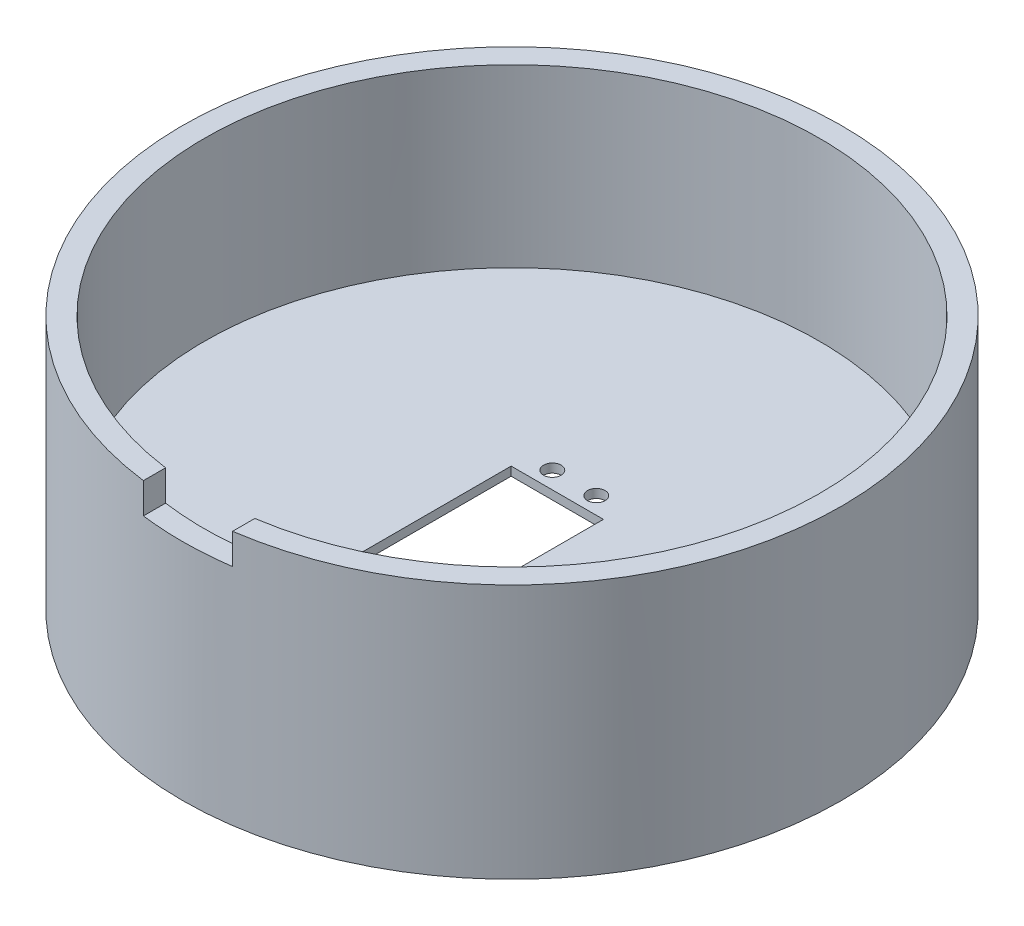
ISO-10303-21;
HEADER;
FILE_DESCRIPTION(('STEP AP214'),'2;1');
FILE_NAME('part.step','',(''),(''),'','','');
FILE_SCHEMA(('AUTOMOTIVE_DESIGN { 1 0 10303 214 1 1 1 1 }'));
ENDSEC;
DATA;
#1=APPLICATION_CONTEXT('core data for automotive mechanical design processes');
#2=APPLICATION_PROTOCOL_DEFINITION('international standard','automotive_design',2000,#1);
#3=PRODUCT_CONTEXT('',#1,'mechanical');
#4=PRODUCT('Part','Part','',(#3));
#5=PRODUCT_RELATED_PRODUCT_CATEGORY('part','',(#4));
#6=PRODUCT_DEFINITION_FORMATION('','',#4);
#7=PRODUCT_DEFINITION_CONTEXT('part definition',#1,'design');
#8=PRODUCT_DEFINITION('design','',#6,#7);
#9=PRODUCT_DEFINITION_SHAPE('','',#8);
#10=(LENGTH_UNIT() NAMED_UNIT(*) SI_UNIT(.MILLI.,.METRE.));
#11=(NAMED_UNIT(*) PLANE_ANGLE_UNIT() SI_UNIT($,.RADIAN.));
#12=(NAMED_UNIT(*) SI_UNIT($,.STERADIAN.) SOLID_ANGLE_UNIT());
#13=UNCERTAINTY_MEASURE_WITH_UNIT(LENGTH_MEASURE(1.E-05),#10,'distance_accuracy_value','');
#14=(GEOMETRIC_REPRESENTATION_CONTEXT(3) GLOBAL_UNCERTAINTY_ASSIGNED_CONTEXT((#13)) GLOBAL_UNIT_ASSIGNED_CONTEXT((#10,
#11,#12)) REPRESENTATION_CONTEXT('',''));
#15=CARTESIAN_POINT('',(0.,0.,0.));
#16=DIRECTION('',(0.,0.,1.));
#17=DIRECTION('',(1.,0.,0.));
#18=AXIS2_PLACEMENT_3D('',#15,#16,#17);
#19=CARTESIAN_POINT('',(0.,-2.,0.));
#20=DIRECTION('',(0.,1.,0.));
#21=DIRECTION('',(0.,0.,1.));
#22=AXIS2_PLACEMENT_3D('',#19,#20,#21);
#23=PLANE('',#22);
#24=CARTESIAN_POINT('',(5.,-2.,34.4507273600907));
#25=DIRECTION('',(0.,1.,0.));
#26=DIRECTION('',(0.,0.,1.));
#27=AXIS2_PLACEMENT_3D('',#24,#25,#26);
#28=CIRCLE('',#27,2.);
#29=CARTESIAN_POINT('',(5.,-2.,36.4507273600907));
#30=VERTEX_POINT('',#29);
#31=EDGE_CURVE('E162',#30,#30,#28,.F.);
#32=ORIENTED_EDGE('',*,*,#31,.F.);
#33=EDGE_LOOP('',(#32));
#34=FACE_BOUND('',#33,.T.);
#35=CARTESIAN_POINT('',(-4.99999999999999,-2.,34.4507273600907));
#36=DIRECTION('',(0.,1.,0.));
#37=DIRECTION('',(0.,0.,1.));
#38=AXIS2_PLACEMENT_3D('',#35,#36,#37);
#39=CIRCLE('',#38,2.);
#40=CARTESIAN_POINT('',(-4.99999999999999,-2.,36.4507273600907));
#41=VERTEX_POINT('',#40);
#42=EDGE_CURVE('E195',#41,#41,#39,.T.);
#43=ORIENTED_EDGE('',*,*,#42,.T.);
#44=EDGE_LOOP('',(#43));
#45=FACE_BOUND('',#44,.T.);
#46=CARTESIAN_POINT('',(-4.99999999999999,-2.,-14.1792726399093));
#47=DIRECTION('',(0.,1.,0.));
#48=DIRECTION('',(0.,0.,1.));
#49=AXIS2_PLACEMENT_3D('',#46,#47,#48);
#50=CIRCLE('',#49,2.);
#51=CARTESIAN_POINT('',(-4.99999999999999,-2.,-12.1792726399093));
#52=VERTEX_POINT('',#51);
#53=EDGE_CURVE('E198',#52,#52,#50,.T.);
#54=ORIENTED_EDGE('',*,*,#53,.T.);
#55=EDGE_LOOP('',(#54));
#56=FACE_BOUND('',#55,.T.);
#57=DIRECTION('',(1.,0.,0.));
#58=VECTOR('',#57,1.);
#59=CARTESIAN_POINT('',(0.,-2.,-10.3));
#60=LINE('',#59,#58);
#61=CARTESIAN_POINT('',(-10.5,-2.,-10.3));
#62=VERTEX_POINT('',#61);
#63=CARTESIAN_POINT('',(10.5,-2.,-10.3));
#64=VERTEX_POINT('',#63);
#65=EDGE_CURVE('E208',#62,#64,#60,.T.);
#66=ORIENTED_EDGE('',*,*,#65,.F.);
#67=DIRECTION('',(0.,0.,1.));
#68=VECTOR('',#67,1.);
#69=CARTESIAN_POINT('',(-10.5,-2.,0.));
#70=LINE('',#69,#68);
#71=CARTESIAN_POINT('',(-10.5,-2.,30.7));
#72=VERTEX_POINT('',#71);
#73=EDGE_CURVE('E201',#62,#72,#70,.T.);
#74=ORIENTED_EDGE('',*,*,#73,.T.);
#75=DIRECTION('',(1.,0.,0.));
#76=VECTOR('',#75,1.);
#77=CARTESIAN_POINT('',(0.,-2.,30.7));
#78=LINE('',#77,#76);
#79=CARTESIAN_POINT('',(10.5,-2.,30.7));
#80=VERTEX_POINT('',#79);
#81=EDGE_CURVE('E204',#72,#80,#78,.T.);
#82=ORIENTED_EDGE('',*,*,#81,.T.);
#83=DIRECTION('',(0.,0.,1.));
#84=VECTOR('',#83,1.);
#85=CARTESIAN_POINT('',(10.5,-2.,0.));
#86=LINE('',#85,#84);
#87=EDGE_CURVE('E206',#64,#80,#86,.T.);
#88=ORIENTED_EDGE('',*,*,#87,.F.);
#89=EDGE_LOOP('',(#66,#74,#82,#88));
#90=FACE_BOUND('',#89,.T.);
#91=CARTESIAN_POINT('',(4.99999999999999,-2.,-14.1792726399093));
#92=DIRECTION('',(0.,1.,0.));
#93=DIRECTION('',(0.,0.,1.));
#94=AXIS2_PLACEMENT_3D('',#91,#92,#93);
#95=CIRCLE('',#94,2.);
#96=CARTESIAN_POINT('',(4.99999999999999,-2.,-12.1792726399093));
#97=VERTEX_POINT('',#96);
#98=EDGE_CURVE('E171',#97,#97,#95,.F.);
#99=ORIENTED_EDGE('',*,*,#98,.F.);
#100=EDGE_LOOP('',(#99));
#101=FACE_BOUND('',#100,.T.);
#102=CARTESIAN_POINT('',(0.,-2.,0.));
#103=DIRECTION('',(0.,1.,0.));
#104=DIRECTION('',(0.,0.,1.));
#105=AXIS2_PLACEMENT_3D('',#102,#103,#104);
#106=CIRCLE('',#105,70.);
#107=CARTESIAN_POINT('',(0.,-2.,70.));
#108=VERTEX_POINT('',#107);
#109=EDGE_CURVE('E11',#108,#108,#106,.T.);
#110=ORIENTED_EDGE('',*,*,#109,.F.);
#111=EDGE_LOOP('',(#110));
#112=FACE_BOUND('',#111,.T.);
#113=ADVANCED_FACE('F55',(#34,#45,#56,#90,#101,#112),#23,.F.);
#114=CARTESIAN_POINT('',(0.,-2.,-10.3));
#115=DIRECTION('',(0.,0.,1.));
#116=DIRECTION('',(1.,0.,0.));
#117=AXIS2_PLACEMENT_3D('',#114,#115,#116);
#118=PLANE('',#117);
#119=DIRECTION('',(1.,0.,0.));
#120=VECTOR('',#119,1.);
#121=CARTESIAN_POINT('',(0.,0.,-10.3));
#122=LINE('',#121,#120);
#123=CARTESIAN_POINT('',(-10.5,0.,-10.3));
#124=VERTEX_POINT('',#123);
#125=CARTESIAN_POINT('',(10.5,0.,-10.3));
#126=VERTEX_POINT('',#125);
#127=EDGE_CURVE('E186',#124,#126,#122,.T.);
#128=ORIENTED_EDGE('',*,*,#127,.F.);
#129=DIRECTION('',(0.,1.,0.));
#130=VECTOR('',#129,1.);
#131=CARTESIAN_POINT('',(-10.5,-2.,-10.3));
#132=LINE('',#131,#130);
#133=EDGE_CURVE('E80',#62,#124,#132,.T.);
#134=ORIENTED_EDGE('',*,*,#133,.F.);
#135=ORIENTED_EDGE('',*,*,#65,.T.);
#136=DIRECTION('',(0.,1.,0.));
#137=VECTOR('',#136,1.);
#138=CARTESIAN_POINT('',(10.5,-2.,-10.3));
#139=LINE('',#138,#137);
#140=EDGE_CURVE('E106',#64,#126,#139,.T.);
#141=ORIENTED_EDGE('',*,*,#140,.T.);
#142=EDGE_LOOP('',(#128,#134,#135,#141));
#143=FACE_BOUND('',#142,.T.);
#144=ADVANCED_FACE('F239',(#143),#118,.T.);
#145=CARTESIAN_POINT('',(-10.5,-2.,0.));
#146=DIRECTION('',(-1.,0.,0.));
#147=DIRECTION('',(0.,0.,1.));
#148=AXIS2_PLACEMENT_3D('',#145,#146,#147);
#149=PLANE('',#148);
#150=DIRECTION('',(0.,0.,1.));
#151=VECTOR('',#150,1.);
#152=CARTESIAN_POINT('',(-10.5,0.,0.));
#153=LINE('',#152,#151);
#154=CARTESIAN_POINT('',(-10.5,0.,30.7));
#155=VERTEX_POINT('',#154);
#156=EDGE_CURVE('E178',#124,#155,#153,.T.);
#157=ORIENTED_EDGE('',*,*,#156,.T.);
#158=DIRECTION('',(0.,1.,0.));
#159=VECTOR('',#158,1.);
#160=CARTESIAN_POINT('',(-10.5,-2.,30.7));
#161=LINE('',#160,#159);
#162=EDGE_CURVE('E164',#72,#155,#161,.T.);
#163=ORIENTED_EDGE('',*,*,#162,.F.);
#164=ORIENTED_EDGE('',*,*,#73,.F.);
#165=ORIENTED_EDGE('',*,*,#133,.T.);
#166=EDGE_LOOP('',(#157,#163,#164,#165));
#167=FACE_BOUND('',#166,.T.);
#168=ADVANCED_FACE('F246',(#167),#149,.F.);
#169=CARTESIAN_POINT('',(0.,-2.,30.7));
#170=DIRECTION('',(0.,0.,1.));
#171=DIRECTION('',(1.,0.,0.));
#172=AXIS2_PLACEMENT_3D('',#169,#170,#171);
#173=PLANE('',#172);
#174=DIRECTION('',(1.,0.,0.));
#175=VECTOR('',#174,1.);
#176=CARTESIAN_POINT('',(0.,0.,30.7));
#177=LINE('',#176,#175);
#178=CARTESIAN_POINT('',(10.5,0.,30.7));
#179=VERTEX_POINT('',#178);
#180=EDGE_CURVE('E180',#155,#179,#177,.T.);
#181=ORIENTED_EDGE('',*,*,#180,.T.);
#182=DIRECTION('',(0.,1.,0.));
#183=VECTOR('',#182,1.);
#184=CARTESIAN_POINT('',(10.5,-2.,30.7));
#185=LINE('',#184,#183);
#186=EDGE_CURVE('E161',#80,#179,#185,.T.);
#187=ORIENTED_EDGE('',*,*,#186,.F.);
#188=ORIENTED_EDGE('',*,*,#81,.F.);
#189=ORIENTED_EDGE('',*,*,#162,.T.);
#190=EDGE_LOOP('',(#181,#187,#188,#189));
#191=FACE_BOUND('',#190,.T.);
#192=ADVANCED_FACE('F265',(#191),#173,.F.);
#193=CARTESIAN_POINT('',(-4.99999999999999,-2.,34.4507273600907));
#194=DIRECTION('',(0.,1.,0.));
#195=DIRECTION('',(0.,0.,1.));
#196=AXIS2_PLACEMENT_3D('',#193,#194,#195);
#197=CYLINDRICAL_SURFACE('',#196,2.);
#198=ORIENTED_EDGE('',*,*,#42,.F.);
#199=EDGE_LOOP('',(#198));
#200=FACE_BOUND('',#199,.T.);
#201=CARTESIAN_POINT('',(-4.99999999999999,0.,34.4507273600907));
#202=DIRECTION('',(0.,1.,0.));
#203=DIRECTION('',(0.,0.,1.));
#204=AXIS2_PLACEMENT_3D('',#201,#202,#203);
#205=CIRCLE('',#204,2.);
#206=CARTESIAN_POINT('',(-4.99999999999999,0.,36.4507273600907));
#207=VERTEX_POINT('',#206);
#208=EDGE_CURVE('E172',#207,#207,#205,.T.);
#209=ORIENTED_EDGE('',*,*,#208,.T.);
#210=EDGE_LOOP('',(#209));
#211=FACE_BOUND('',#210,.T.);
#212=ADVANCED_FACE('F261',(#200,#211),#197,.F.);
#213=CARTESIAN_POINT('',(-4.99999999999999,-2.,-14.1792726399093));
#214=DIRECTION('',(0.,1.,0.));
#215=DIRECTION('',(0.,0.,1.));
#216=AXIS2_PLACEMENT_3D('',#213,#214,#215);
#217=CYLINDRICAL_SURFACE('',#216,2.);
#218=ORIENTED_EDGE('',*,*,#53,.F.);
#219=EDGE_LOOP('',(#218));
#220=FACE_BOUND('',#219,.T.);
#221=CARTESIAN_POINT('',(-4.99999999999999,0.,-14.1792726399093));
#222=DIRECTION('',(0.,1.,0.));
#223=DIRECTION('',(0.,0.,1.));
#224=AXIS2_PLACEMENT_3D('',#221,#222,#223);
#225=CIRCLE('',#224,2.);
#226=CARTESIAN_POINT('',(-4.99999999999999,0.,-12.1792726399093));
#227=VERTEX_POINT('',#226);
#228=EDGE_CURVE('E175',#227,#227,#225,.T.);
#229=ORIENTED_EDGE('',*,*,#228,.T.);
#230=EDGE_LOOP('',(#229));
#231=FACE_BOUND('',#230,.T.);
#232=ADVANCED_FACE('F264',(#220,#231),#217,.F.);
#233=CARTESIAN_POINT('',(10.5,-2.,0.));
#234=DIRECTION('',(-1.,0.,0.));
#235=DIRECTION('',(0.,0.,1.));
#236=AXIS2_PLACEMENT_3D('',#233,#234,#235);
#237=PLANE('',#236);
#238=DIRECTION('',(0.,0.,1.));
#239=VECTOR('',#238,1.);
#240=CARTESIAN_POINT('',(10.5,0.,0.));
#241=LINE('',#240,#239);
#242=EDGE_CURVE('E183',#126,#179,#241,.T.);
#243=ORIENTED_EDGE('',*,*,#242,.F.);
#244=ORIENTED_EDGE('',*,*,#140,.F.);
#245=ORIENTED_EDGE('',*,*,#87,.T.);
#246=ORIENTED_EDGE('',*,*,#186,.T.);
#247=EDGE_LOOP('',(#243,#244,#245,#246));
#248=FACE_BOUND('',#247,.T.);
#249=ADVANCED_FACE('F269',(#248),#237,.T.);
#250=CARTESIAN_POINT('',(4.99999999999999,-2.,-14.1792726399093));
#251=DIRECTION('',(0.,1.,0.));
#252=DIRECTION('',(0.,0.,1.));
#253=AXIS2_PLACEMENT_3D('',#250,#251,#252);
#254=CYLINDRICAL_SURFACE('',#253,2.);
#255=ORIENTED_EDGE('',*,*,#98,.T.);
#256=EDGE_LOOP('',(#255));
#257=FACE_BOUND('',#256,.T.);
#258=CARTESIAN_POINT('',(4.99999999999999,0.,-14.1792726399093));
#259=DIRECTION('',(0.,1.,0.));
#260=DIRECTION('',(0.,0.,1.));
#261=AXIS2_PLACEMENT_3D('',#258,#259,#260);
#262=CIRCLE('',#261,2.);
#263=CARTESIAN_POINT('',(4.99999999999999,0.,-12.1792726399093));
#264=VERTEX_POINT('',#263);
#265=EDGE_CURVE('E189',#264,#264,#262,.F.);
#266=ORIENTED_EDGE('',*,*,#265,.F.);
#267=EDGE_LOOP('',(#266));
#268=FACE_BOUND('',#267,.T.);
#269=ADVANCED_FACE('F277',(#257,#268),#254,.F.);
#270=CARTESIAN_POINT('',(0.,-2.,0.));
#271=DIRECTION('',(0.,1.,0.));
#272=DIRECTION('',(0.,0.,1.));
#273=AXIS2_PLACEMENT_3D('',#270,#271,#272);
#274=CYLINDRICAL_SURFACE('',#273,75.);
#275=DIRECTION('',(0.,1.,0.));
#276=VECTOR('',#275,1.);
#277=CARTESIAN_POINT('',(-9.47412894203481,-2.,74.3991994633659));
#278=LINE('',#277,#276);
#279=CARTESIAN_POINT('',(-9.47412894203481,40.,74.3991994633659));
#280=VERTEX_POINT('',#279);
#281=CARTESIAN_POINT('',(-9.47412894203481,33.039467397455,74.3991994633659));
#282=VERTEX_POINT('',#281);
#283=EDGE_CURVE('E217',#280,#282,#278,.F.);
#284=ORIENTED_EDGE('',*,*,#283,.F.);
#285=CARTESIAN_POINT('',(0.,40.,0.));
#286=DIRECTION('',(0.,1.,0.));
#287=DIRECTION('',(0.,0.,1.));
#288=AXIS2_PLACEMENT_3D('',#285,#286,#287);
#289=CIRCLE('',#288,75.);
#290=CARTESIAN_POINT('',(10.6593178347119,40.,74.2386620521854));
#291=VERTEX_POINT('',#290);
#292=EDGE_CURVE('E192',#291,#280,#289,.T.);
#293=ORIENTED_EDGE('',*,*,#292,.F.);
#294=DIRECTION('',(0.,1.,0.));
#295=VECTOR('',#294,1.);
#296=CARTESIAN_POINT('',(10.6593178347119,-2.,74.2386620521854));
#297=LINE('',#296,#295);
#298=CARTESIAN_POINT('',(10.6593178347119,33.039467397455,74.2386620521854));
#299=VERTEX_POINT('',#298);
#300=EDGE_CURVE('E71',#299,#291,#297,.T.);
#301=ORIENTED_EDGE('',*,*,#300,.F.);
#302=CARTESIAN_POINT('',(0.,33.039467397455,0.));
#303=DIRECTION('',(0.,-1.,0.));
#304=DIRECTION('',(0.,0.,-1.));
#305=AXIS2_PLACEMENT_3D('',#302,#303,#304);
#306=CIRCLE('',#305,75.);
#307=EDGE_CURVE('E144',#282,#299,#306,.F.);
#308=ORIENTED_EDGE('',*,*,#307,.F.);
#309=EDGE_LOOP('',(#284,#293,#301,#308));
#310=FACE_BOUND('',#309,.T.);
#311=CARTESIAN_POINT('',(0.,-18.,0.));
#312=DIRECTION('',(0.,1.,0.));
#313=DIRECTION('',(0.,0.,1.));
#314=AXIS2_PLACEMENT_3D('',#311,#312,#313);
#315=CIRCLE('',#314,75.);
#316=CARTESIAN_POINT('',(0.,-18.,75.));
#317=VERTEX_POINT('',#316);
#318=EDGE_CURVE('E221',#317,#317,#315,.T.);
#319=ORIENTED_EDGE('',*,*,#318,.T.);
#320=EDGE_LOOP('',(#319));
#321=FACE_BOUND('',#320,.T.);
#322=ADVANCED_FACE('F57',(#310,#321),#274,.T.);
#323=CARTESIAN_POINT('',(5.,-2.,34.4507273600907));
#324=DIRECTION('',(0.,1.,0.));
#325=DIRECTION('',(0.,0.,1.));
#326=AXIS2_PLACEMENT_3D('',#323,#324,#325);
#327=CYLINDRICAL_SURFACE('',#326,2.);
#328=ORIENTED_EDGE('',*,*,#31,.T.);
#329=EDGE_LOOP('',(#328));
#330=FACE_BOUND('',#329,.T.);
#331=CARTESIAN_POINT('',(5.,0.,34.4507273600907));
#332=DIRECTION('',(0.,1.,0.));
#333=DIRECTION('',(0.,0.,1.));
#334=AXIS2_PLACEMENT_3D('',#331,#332,#333);
#335=CIRCLE('',#334,2.);
#336=CARTESIAN_POINT('',(5.,0.,36.4507273600907));
#337=VERTEX_POINT('',#336);
#338=EDGE_CURVE('E168',#337,#337,#335,.F.);
#339=ORIENTED_EDGE('',*,*,#338,.F.);
#340=EDGE_LOOP('',(#339));
#341=FACE_BOUND('',#340,.T.);
#342=ADVANCED_FACE('F256',(#330,#341),#327,.F.);
#343=CARTESIAN_POINT('',(0.,0.,0.));
#344=DIRECTION('',(0.,1.,0.));
#345=DIRECTION('',(0.,0.,1.));
#346=AXIS2_PLACEMENT_3D('',#343,#344,#345);
#347=PLANE('',#346);
#348=CARTESIAN_POINT('',(0.,0.,0.));
#349=DIRECTION('',(0.,1.,0.));
#350=DIRECTION('',(0.,0.,1.));
#351=AXIS2_PLACEMENT_3D('',#348,#349,#350);
#352=CIRCLE('',#351,70.);
#353=CARTESIAN_POINT('',(0.,0.,70.));
#354=VERTEX_POINT('',#353);
#355=EDGE_CURVE('E155',#354,#354,#352,.F.);
#356=ORIENTED_EDGE('',*,*,#355,.F.);
#357=EDGE_LOOP('',(#356));
#358=FACE_BOUND('',#357,.T.);
#359=ORIENTED_EDGE('',*,*,#265,.T.);
#360=EDGE_LOOP('',(#359));
#361=FACE_BOUND('',#360,.T.);
#362=ORIENTED_EDGE('',*,*,#127,.T.);
#363=ORIENTED_EDGE('',*,*,#242,.T.);
#364=ORIENTED_EDGE('',*,*,#180,.F.);
#365=ORIENTED_EDGE('',*,*,#156,.F.);
#366=EDGE_LOOP('',(#362,#363,#364,#365));
#367=FACE_BOUND('',#366,.T.);
#368=ORIENTED_EDGE('',*,*,#228,.F.);
#369=EDGE_LOOP('',(#368));
#370=FACE_BOUND('',#369,.T.);
#371=ORIENTED_EDGE('',*,*,#208,.F.);
#372=EDGE_LOOP('',(#371));
#373=FACE_BOUND('',#372,.T.);
#374=ORIENTED_EDGE('',*,*,#338,.T.);
#375=EDGE_LOOP('',(#374));
#376=FACE_BOUND('',#375,.T.);
#377=ADVANCED_FACE('F253',(#358,#361,#367,#370,#373,#376),#347,.T.);
#378=CARTESIAN_POINT('',(0.,40.,0.));
#379=DIRECTION('',(0.,-1.,0.));
#380=DIRECTION('',(0.,0.,-1.));
#381=AXIS2_PLACEMENT_3D('',#378,#379,#380);
#382=CYLINDRICAL_SURFACE('',#381,70.);
#383=DIRECTION('',(0.,-1.,0.));
#384=VECTOR('',#383,1.);
#385=CARTESIAN_POINT('',(-9.47412894203481,40.,69.3559001152007));
#386=LINE('',#385,#384);
#387=CARTESIAN_POINT('',(-9.47412894203481,33.039467397455,69.3559001152007));
#388=VERTEX_POINT('',#387);
#389=CARTESIAN_POINT('',(-9.47412894203481,40.,69.3559001152007));
#390=VERTEX_POINT('',#389);
#391=EDGE_CURVE('E150',#388,#390,#386,.F.);
#392=ORIENTED_EDGE('',*,*,#391,.F.);
#393=CARTESIAN_POINT('',(0.,33.039467397455,0.));
#394=DIRECTION('',(0.,-1.,0.));
#395=DIRECTION('',(0.,0.,-1.));
#396=AXIS2_PLACEMENT_3D('',#393,#394,#395);
#397=CIRCLE('',#396,70.);
#398=CARTESIAN_POINT('',(10.6593178347119,33.039467397455,69.1836609561723));
#399=VERTEX_POINT('',#398);
#400=EDGE_CURVE('E59',#399,#388,#397,.T.);
#401=ORIENTED_EDGE('',*,*,#400,.F.);
#402=DIRECTION('',(0.,-1.,0.));
#403=VECTOR('',#402,1.);
#404=CARTESIAN_POINT('',(10.6593178347119,40.,69.1836609561723));
#405=LINE('',#404,#403);
#406=CARTESIAN_POINT('',(10.6593178347119,40.,69.1836609561723));
#407=VERTEX_POINT('',#406);
#408=EDGE_CURVE('E129',#407,#399,#405,.T.);
#409=ORIENTED_EDGE('',*,*,#408,.F.);
#410=CARTESIAN_POINT('',(0.,40.,0.));
#411=DIRECTION('',(0.,1.,0.));
#412=DIRECTION('',(0.,0.,1.));
#413=AXIS2_PLACEMENT_3D('',#410,#411,#412);
#414=CIRCLE('',#413,70.);
#415=EDGE_CURVE('E214',#407,#390,#414,.T.);
#416=ORIENTED_EDGE('',*,*,#415,.T.);
#417=EDGE_LOOP('',(#392,#401,#409,#416));
#418=FACE_BOUND('',#417,.T.);
#419=ORIENTED_EDGE('',*,*,#355,.T.);
#420=EDGE_LOOP('',(#419));
#421=FACE_BOUND('',#420,.T.);
#422=ADVANCED_FACE('F148',(#418,#421),#382,.F.);
#423=CARTESIAN_POINT('',(0.,40.,0.));
#424=DIRECTION('',(0.,1.,0.));
#425=DIRECTION('',(0.,0.,1.));
#426=AXIS2_PLACEMENT_3D('',#423,#424,#425);
#427=PLANE('',#426);
#428=DIRECTION('',(0.,0.,1.));
#429=VECTOR('',#428,1.);
#430=CARTESIAN_POINT('',(-9.47412894203481,40.,0.));
#431=LINE('',#430,#429);
#432=EDGE_CURVE('E151',#390,#280,#431,.T.);
#433=ORIENTED_EDGE('',*,*,#432,.F.);
#434=ORIENTED_EDGE('',*,*,#415,.F.);
#435=DIRECTION('',(0.,0.,-1.));
#436=VECTOR('',#435,1.);
#437=CARTESIAN_POINT('',(10.6593178347119,40.,0.));
#438=LINE('',#437,#436);
#439=EDGE_CURVE('E133',#291,#407,#438,.T.);
#440=ORIENTED_EDGE('',*,*,#439,.F.);
#441=ORIENTED_EDGE('',*,*,#292,.T.);
#442=EDGE_LOOP('',(#433,#434,#440,#441));
#443=FACE_BOUND('',#442,.T.);
#444=ADVANCED_FACE('F318',(#443),#427,.T.);
#445=CARTESIAN_POINT('',(-9.47412894203481,40.3764290712947,35.));
#446=DIRECTION('',(-1.,0.,0.));
#447=DIRECTION('',(0.,0.,1.));
#448=AXIS2_PLACEMENT_3D('',#445,#446,#447);
#449=PLANE('',#448);
#450=ORIENTED_EDGE('',*,*,#283,.T.);
#451=DIRECTION('',(0.,0.,1.));
#452=VECTOR('',#451,1.);
#453=CARTESIAN_POINT('',(-9.47412894203481,33.039467397455,35.));
#454=LINE('',#453,#452);
#455=EDGE_CURVE('E145',#388,#282,#454,.T.);
#456=ORIENTED_EDGE('',*,*,#455,.F.);
#457=ORIENTED_EDGE('',*,*,#391,.T.);
#458=ORIENTED_EDGE('',*,*,#432,.T.);
#459=EDGE_LOOP('',(#450,#456,#457,#458));
#460=FACE_BOUND('',#459,.T.);
#461=ADVANCED_FACE('F314',(#460),#449,.F.);
#462=CARTESIAN_POINT('',(10.6593178347119,40.3764290712947,35.));
#463=DIRECTION('',(1.,0.,0.));
#464=DIRECTION('',(0.,0.,-1.));
#465=AXIS2_PLACEMENT_3D('',#462,#463,#464);
#466=PLANE('',#465);
#467=ORIENTED_EDGE('',*,*,#300,.T.);
#468=ORIENTED_EDGE('',*,*,#439,.T.);
#469=ORIENTED_EDGE('',*,*,#408,.T.);
#470=DIRECTION('',(0.,0.,1.));
#471=VECTOR('',#470,1.);
#472=CARTESIAN_POINT('',(10.6593178347119,33.039467397455,35.));
#473=LINE('',#472,#471);
#474=EDGE_CURVE('E132',#399,#299,#473,.T.);
#475=ORIENTED_EDGE('',*,*,#474,.T.);
#476=EDGE_LOOP('',(#467,#468,#469,#475));
#477=FACE_BOUND('',#476,.T.);
#478=ADVANCED_FACE('F131',(#477),#466,.F.);
#479=CARTESIAN_POINT('',(-9.47412894203481,33.039467397455,35.));
#480=DIRECTION('',(0.,-1.,0.));
#481=DIRECTION('',(0.,0.,-1.));
#482=AXIS2_PLACEMENT_3D('',#479,#480,#481);
#483=PLANE('',#482);
#484=ORIENTED_EDGE('',*,*,#307,.T.);
#485=ORIENTED_EDGE('',*,*,#474,.F.);
#486=ORIENTED_EDGE('',*,*,#400,.T.);
#487=ORIENTED_EDGE('',*,*,#455,.T.);
#488=EDGE_LOOP('',(#484,#485,#486,#487));
#489=FACE_BOUND('',#488,.T.);
#490=ADVANCED_FACE('F140',(#489),#483,.F.);
#491=CARTESIAN_POINT('',(0.,-18.,0.));
#492=DIRECTION('',(0.,1.,0.));
#493=DIRECTION('',(0.,0.,1.));
#494=AXIS2_PLACEMENT_3D('',#491,#492,#493);
#495=CYLINDRICAL_SURFACE('',#494,70.);
#496=CARTESIAN_POINT('',(0.,-18.,0.));
#497=DIRECTION('',(0.,1.,0.));
#498=DIRECTION('',(0.,0.,1.));
#499=AXIS2_PLACEMENT_3D('',#496,#497,#498);
#500=CIRCLE('',#499,70.);
#501=CARTESIAN_POINT('',(0.,-18.,70.));
#502=VERTEX_POINT('',#501);
#503=EDGE_CURVE('E225',#502,#502,#500,.T.);
#504=ORIENTED_EDGE('',*,*,#503,.F.);
#505=EDGE_LOOP('',(#504));
#506=FACE_BOUND('',#505,.T.);
#507=ORIENTED_EDGE('',*,*,#109,.T.);
#508=EDGE_LOOP('',(#507));
#509=FACE_BOUND('',#508,.T.);
#510=ADVANCED_FACE('F232',(#506,#509),#495,.F.);
#511=CARTESIAN_POINT('',(0.,-18.,0.));
#512=DIRECTION('',(0.,1.,0.));
#513=DIRECTION('',(0.,0.,1.));
#514=AXIS2_PLACEMENT_3D('',#511,#512,#513);
#515=PLANE('',#514);
#516=ORIENTED_EDGE('',*,*,#503,.T.);
#517=EDGE_LOOP('',(#516));
#518=FACE_BOUND('',#517,.T.);
#519=ORIENTED_EDGE('',*,*,#318,.F.);
#520=EDGE_LOOP('',(#519));
#521=FACE_BOUND('',#520,.T.);
#522=ADVANCED_FACE('F229',(#518,#521),#515,.F.);
#523=CLOSED_SHELL('',(#113,#144,#168,#192,#212,#232,#249,#269,#322,#342,#377,#422,#444,#461,
#478,#490,#510,#522));
#524=MANIFOLD_SOLID_BREP('B2',#523);
#525=ADVANCED_BREP_SHAPE_REPRESENTATION('',(#18,#524),#14);
#526=SHAPE_DEFINITION_REPRESENTATION(#9,#525);
ENDSEC;
END-ISO-10303-21;
